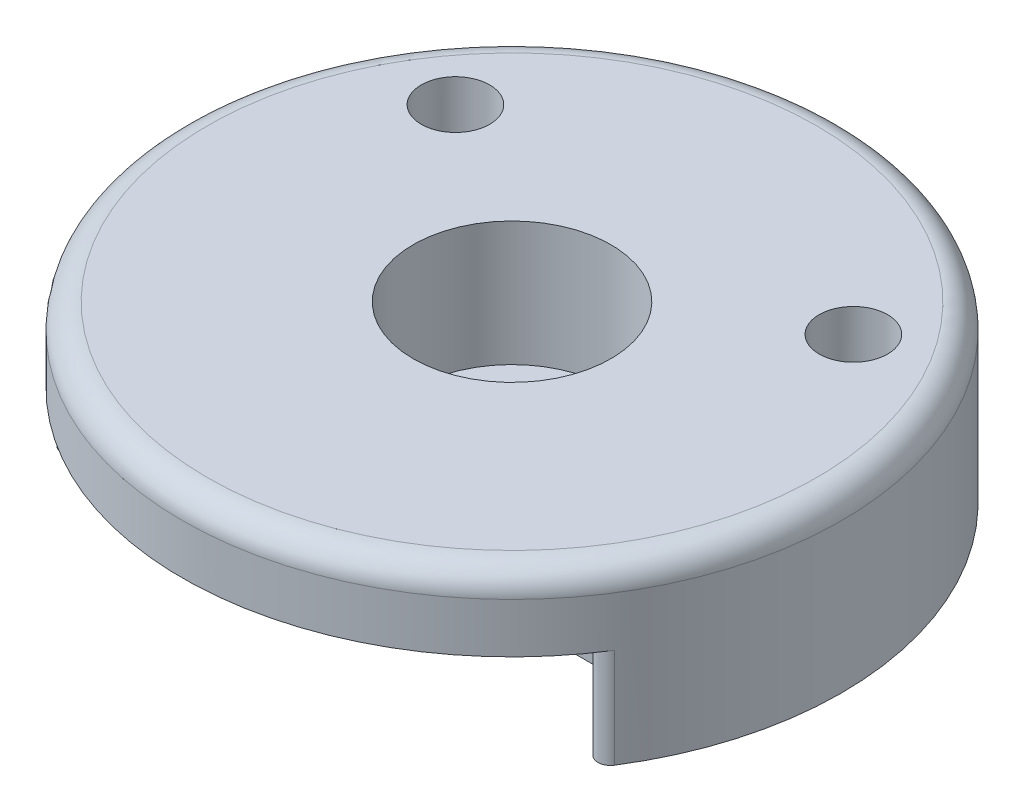
ISO-10303-21;
HEADER;
FILE_DESCRIPTION(('STEP AP214'),'2;1');
FILE_NAME('part.step','',(''),(''),'','','');
FILE_SCHEMA(('AUTOMOTIVE_DESIGN { 1 0 10303 214 1 1 1 1 }'));
ENDSEC;
DATA;
#1=APPLICATION_CONTEXT('core data for automotive mechanical design processes');
#2=APPLICATION_PROTOCOL_DEFINITION('international standard','automotive_design',2000,#1);
#3=PRODUCT_CONTEXT('',#1,'mechanical');
#4=PRODUCT('Part','Part','',(#3));
#5=PRODUCT_RELATED_PRODUCT_CATEGORY('part','',(#4));
#6=PRODUCT_DEFINITION_FORMATION('','',#4);
#7=PRODUCT_DEFINITION_CONTEXT('part definition',#1,'design');
#8=PRODUCT_DEFINITION('design','',#6,#7);
#9=PRODUCT_DEFINITION_SHAPE('','',#8);
#10=(LENGTH_UNIT() NAMED_UNIT(*) SI_UNIT(.MILLI.,.METRE.));
#11=(NAMED_UNIT(*) PLANE_ANGLE_UNIT() SI_UNIT($,.RADIAN.));
#12=(NAMED_UNIT(*) SI_UNIT($,.STERADIAN.) SOLID_ANGLE_UNIT());
#13=UNCERTAINTY_MEASURE_WITH_UNIT(LENGTH_MEASURE(1.E-05),#10,'distance_accuracy_value','');
#14=(GEOMETRIC_REPRESENTATION_CONTEXT(3) GLOBAL_UNCERTAINTY_ASSIGNED_CONTEXT((#13)) GLOBAL_UNIT_ASSIGNED_CONTEXT((#10,
#11,#12)) REPRESENTATION_CONTEXT('',''));
#15=CARTESIAN_POINT('',(0.,0.,0.));
#16=DIRECTION('',(0.,0.,1.));
#17=DIRECTION('',(1.,0.,0.));
#18=AXIS2_PLACEMENT_3D('',#15,#16,#17);
#19=CARTESIAN_POINT('',(0.,7.,0.));
#20=DIRECTION('',(0.,-1.,0.));
#21=DIRECTION('',(0.,0.,-1.));
#22=AXIS2_PLACEMENT_3D('',#19,#20,#21);
#23=CYLINDRICAL_SURFACE('',#22,13.25);
#24=CARTESIAN_POINT('',(0.,6.,0.));
#25=DIRECTION('',(0.,1.,0.));
#26=DIRECTION('',(0.,0.,1.));
#27=AXIS2_PLACEMENT_3D('',#24,#25,#26);
#28=CIRCLE('',#27,13.25);
#29=CARTESIAN_POINT('',(0.,6.,13.25));
#30=VERTEX_POINT('',#29);
#31=EDGE_CURVE('E191',#30,#30,#28,.F.);
#32=ORIENTED_EDGE('',*,*,#31,.T.);
#33=EDGE_LOOP('',(#32));
#34=FACE_BOUND('',#33,.T.);
#35=CARTESIAN_POINT('',(0.,4.,0.));
#36=DIRECTION('',(0.,-1.,0.));
#37=DIRECTION('',(0.,0.,-1.));
#38=AXIS2_PLACEMENT_3D('',#35,#36,#37);
#39=CIRCLE('',#38,13.25);
#40=CARTESIAN_POINT('',(11.1975490196078,4.,7.08360049363877));
#41=VERTEX_POINT('',#40);
#42=CARTESIAN_POINT('',(-11.1975490196078,4.,7.08360049363877));
#43=VERTEX_POINT('',#42);
#44=EDGE_CURVE('E198',#41,#43,#39,.T.);
#45=ORIENTED_EDGE('',*,*,#44,.F.);
#46=DIRECTION('',(0.,-1.,0.));
#47=VECTOR('',#46,1.);
#48=CARTESIAN_POINT('',(11.1975490196078,7.,7.08360049363877));
#49=LINE('',#48,#47);
#50=CARTESIAN_POINT('',(11.1975490196078,0.,7.08360049363877));
#51=VERTEX_POINT('',#50);
#52=EDGE_CURVE('E209',#41,#51,#49,.T.);
#53=ORIENTED_EDGE('',*,*,#52,.T.);
#54=CARTESIAN_POINT('',(0.,0.,0.));
#55=DIRECTION('',(0.,1.,0.));
#56=DIRECTION('',(0.,0.,1.));
#57=AXIS2_PLACEMENT_3D('',#54,#55,#56);
#58=CIRCLE('',#57,13.25);
#59=CARTESIAN_POINT('',(-11.1975490196078,0.,7.08360049363877));
#60=VERTEX_POINT('',#59);
#61=EDGE_CURVE('E180',#51,#60,#58,.T.);
#62=ORIENTED_EDGE('',*,*,#61,.T.);
#63=DIRECTION('',(0.,-1.,0.));
#64=VECTOR('',#63,1.);
#65=CARTESIAN_POINT('',(-11.1975490196078,7.,7.08360049363877));
#66=LINE('',#65,#64);
#67=EDGE_CURVE('E205',#60,#43,#66,.F.);
#68=ORIENTED_EDGE('',*,*,#67,.T.);
#69=EDGE_LOOP('',(#45,#53,#62,#68));
#70=FACE_BOUND('',#69,.T.);
#71=ADVANCED_FACE('F39',(#34,#70),#23,.T.);
#72=CARTESIAN_POINT('',(0.,0.,0.));
#73=DIRECTION('',(0.,1.,0.));
#74=DIRECTION('',(0.,0.,1.));
#75=AXIS2_PLACEMENT_3D('',#72,#73,#74);
#76=PLANE('',#75);
#77=ORIENTED_EDGE('',*,*,#61,.F.);
#78=CARTESIAN_POINT('',(10.775,0.,6.81629481463353));
#79=DIRECTION('',(0.,1.,0.));
#80=DIRECTION('',(0.,0.,1.));
#81=AXIS2_PLACEMENT_3D('',#78,#79,#80);
#82=CIRCLE('',#81,0.5);
#83=CARTESIAN_POINT('',(10.275,0.,6.81629481463353));
#84=VERTEX_POINT('',#83);
#85=EDGE_CURVE('E214',#51,#84,#82,.F.);
#86=ORIENTED_EDGE('',*,*,#85,.T.);
#87=DIRECTION('',(0.,0.,1.));
#88=VECTOR('',#87,1.);
#89=CARTESIAN_POINT('',(10.275,0.,8.025));
#90=LINE('',#89,#88);
#91=CARTESIAN_POINT('',(10.275,0.,-8.025));
#92=VERTEX_POINT('',#91);
#93=EDGE_CURVE('E141',#92,#84,#90,.T.);
#94=ORIENTED_EDGE('',*,*,#93,.F.);
#95=DIRECTION('',(1.,0.,0.));
#96=VECTOR('',#95,1.);
#97=CARTESIAN_POINT('',(-10.275,0.,-8.025));
#98=LINE('',#97,#96);
#99=CARTESIAN_POINT('',(-10.275,0.,-8.025));
#100=VERTEX_POINT('',#99);
#101=EDGE_CURVE('E152',#100,#92,#98,.T.);
#102=ORIENTED_EDGE('',*,*,#101,.F.);
#103=DIRECTION('',(0.,0.,-1.));
#104=VECTOR('',#103,1.);
#105=CARTESIAN_POINT('',(-10.275,0.,8.025));
#106=LINE('',#105,#104);
#107=CARTESIAN_POINT('',(-10.275,0.,6.81629481463354));
#108=VERTEX_POINT('',#107);
#109=EDGE_CURVE('E163',#108,#100,#106,.T.);
#110=ORIENTED_EDGE('',*,*,#109,.F.);
#111=CARTESIAN_POINT('',(-10.775,0.,6.81629481463354));
#112=DIRECTION('',(0.,1.,0.));
#113=DIRECTION('',(0.,0.,1.));
#114=AXIS2_PLACEMENT_3D('',#111,#112,#113);
#115=CIRCLE('',#114,0.5);
#116=EDGE_CURVE('E61',#108,#60,#115,.F.);
#117=ORIENTED_EDGE('',*,*,#116,.T.);
#118=EDGE_LOOP('',(#77,#86,#94,#102,#110,#117));
#119=FACE_BOUND('',#118,.T.);
#120=ADVANCED_FACE('F229',(#119),#76,.F.);
#121=CARTESIAN_POINT('',(0.,1.,0.));
#122=DIRECTION('',(0.,-1.,0.));
#123=DIRECTION('',(0.,0.,-1.));
#124=AXIS2_PLACEMENT_3D('',#121,#122,#123);
#125=PLANE('',#124);
#126=CARTESIAN_POINT('',(-8.,1.,-5.725));
#127=DIRECTION('',(0.,-1.,0.));
#128=DIRECTION('',(0.,0.,-1.));
#129=AXIS2_PLACEMENT_3D('',#126,#127,#128);
#130=CIRCLE('',#129,1.375);
#131=CARTESIAN_POINT('',(-8.,1.,-7.1));
#132=VERTEX_POINT('',#131);
#133=EDGE_CURVE('E132',#132,#132,#130,.T.);
#134=ORIENTED_EDGE('',*,*,#133,.F.);
#135=EDGE_LOOP('',(#134));
#136=FACE_BOUND('',#135,.T.);
#137=CARTESIAN_POINT('',(8.,1.,-5.725));
#138=DIRECTION('',(0.,-1.,0.));
#139=DIRECTION('',(0.,0.,-1.));
#140=AXIS2_PLACEMENT_3D('',#137,#138,#139);
#141=CIRCLE('',#140,1.375);
#142=CARTESIAN_POINT('',(8.,1.,-7.1));
#143=VERTEX_POINT('',#142);
#144=EDGE_CURVE('E121',#143,#143,#141,.T.);
#145=ORIENTED_EDGE('',*,*,#144,.F.);
#146=EDGE_LOOP('',(#145));
#147=FACE_BOUND('',#146,.T.);
#148=DIRECTION('',(0.,0.,1.));
#149=VECTOR('',#148,1.);
#150=CARTESIAN_POINT('',(10.275,1.,8.025));
#151=LINE('',#150,#149);
#152=CARTESIAN_POINT('',(10.275,1.,-8.025));
#153=VERTEX_POINT('',#152);
#154=CARTESIAN_POINT('',(10.275,1.,5.));
#155=VERTEX_POINT('',#154);
#156=EDGE_CURVE('E148',#153,#155,#151,.T.);
#157=ORIENTED_EDGE('',*,*,#156,.T.);
#158=DIRECTION('',(-1.,0.,0.));
#159=VECTOR('',#158,1.);
#160=CARTESIAN_POINT('',(0.,1.,5.));
#161=LINE('',#160,#159);
#162=CARTESIAN_POINT('',(-10.275,1.,5.));
#163=VERTEX_POINT('',#162);
#164=EDGE_CURVE('E195',#155,#163,#161,.T.);
#165=ORIENTED_EDGE('',*,*,#164,.T.);
#166=DIRECTION('',(0.,0.,-1.));
#167=VECTOR('',#166,1.);
#168=CARTESIAN_POINT('',(-10.275,1.,8.025));
#169=LINE('',#168,#167);
#170=CARTESIAN_POINT('',(-10.275,1.,-8.025));
#171=VERTEX_POINT('',#170);
#172=EDGE_CURVE('E116',#163,#171,#169,.T.);
#173=ORIENTED_EDGE('',*,*,#172,.T.);
#174=DIRECTION('',(1.,0.,0.));
#175=VECTOR('',#174,1.);
#176=CARTESIAN_POINT('',(-10.275,1.,-8.025));
#177=LINE('',#176,#175);
#178=EDGE_CURVE('E155',#171,#153,#177,.T.);
#179=ORIENTED_EDGE('',*,*,#178,.T.);
#180=EDGE_LOOP('',(#157,#165,#173,#179));
#181=FACE_BOUND('',#180,.T.);
#182=ADVANCED_FACE('F238',(#136,#147,#181),#125,.T.);
#183=CARTESIAN_POINT('',(0.,7.,0.));
#184=DIRECTION('',(0.,1.,0.));
#185=DIRECTION('',(0.,0.,1.));
#186=AXIS2_PLACEMENT_3D('',#183,#184,#185);
#187=PLANE('',#186);
#188=CARTESIAN_POINT('',(0.,7.,0.));
#189=DIRECTION('',(0.,1.,0.));
#190=DIRECTION('',(0.,0.,1.));
#191=AXIS2_PLACEMENT_3D('',#188,#189,#190);
#192=CIRCLE('',#191,12.25);
#193=CARTESIAN_POINT('',(0.,7.,12.25));
#194=VERTEX_POINT('',#193);
#195=EDGE_CURVE('E187',#194,#194,#192,.T.);
#196=ORIENTED_EDGE('',*,*,#195,.T.);
#197=EDGE_LOOP('',(#196));
#198=FACE_BOUND('',#197,.T.);
#199=CARTESIAN_POINT('',(-8.,7.,-5.725));
#200=DIRECTION('',(0.,1.,0.));
#201=DIRECTION('',(0.,0.,1.));
#202=AXIS2_PLACEMENT_3D('',#199,#200,#201);
#203=CIRCLE('',#202,1.375);
#204=CARTESIAN_POINT('',(-8.,7.,-4.35));
#205=VERTEX_POINT('',#204);
#206=EDGE_CURVE('E136',#205,#205,#203,.F.);
#207=ORIENTED_EDGE('',*,*,#206,.T.);
#208=EDGE_LOOP('',(#207));
#209=FACE_BOUND('',#208,.T.);
#210=CARTESIAN_POINT('',(8.,7.,-5.725));
#211=DIRECTION('',(0.,1.,0.));
#212=DIRECTION('',(0.,0.,1.));
#213=AXIS2_PLACEMENT_3D('',#210,#211,#212);
#214=CIRCLE('',#213,1.375);
#215=CARTESIAN_POINT('',(8.,7.,-4.35));
#216=VERTEX_POINT('',#215);
#217=EDGE_CURVE('E137',#216,#216,#214,.F.);
#218=ORIENTED_EDGE('',*,*,#217,.T.);
#219=EDGE_LOOP('',(#218));
#220=FACE_BOUND('',#219,.T.);
#221=CARTESIAN_POINT('',(0.,7.,0.));
#222=DIRECTION('',(0.,1.,0.));
#223=DIRECTION('',(0.,0.,1.));
#224=AXIS2_PLACEMENT_3D('',#221,#222,#223);
#225=CIRCLE('',#224,3.975);
#226=CARTESIAN_POINT('',(0.,7.,3.975));
#227=VERTEX_POINT('',#226);
#228=EDGE_CURVE('E172',#227,#227,#225,.T.);
#229=ORIENTED_EDGE('',*,*,#228,.F.);
#230=EDGE_LOOP('',(#229));
#231=FACE_BOUND('',#230,.T.);
#232=ADVANCED_FACE('F286',(#198,#209,#220,#231),#187,.T.);
#233=CARTESIAN_POINT('',(0.,2.,0.));
#234=DIRECTION('',(0.,1.,0.));
#235=DIRECTION('',(0.,0.,1.));
#236=AXIS2_PLACEMENT_3D('',#233,#234,#235);
#237=CYLINDRICAL_SURFACE('',#236,3.975);
#238=CARTESIAN_POINT('',(0.,2.,0.));
#239=DIRECTION('',(0.,1.,0.));
#240=DIRECTION('',(0.,0.,1.));
#241=AXIS2_PLACEMENT_3D('',#238,#239,#240);
#242=CIRCLE('',#241,3.975);
#243=CARTESIAN_POINT('',(0.,2.,3.975));
#244=VERTEX_POINT('',#243);
#245=EDGE_CURVE('E176',#244,#244,#242,.T.);
#246=ORIENTED_EDGE('',*,*,#245,.F.);
#247=EDGE_LOOP('',(#246));
#248=FACE_BOUND('',#247,.T.);
#249=ORIENTED_EDGE('',*,*,#228,.T.);
#250=EDGE_LOOP('',(#249));
#251=FACE_BOUND('',#250,.T.);
#252=ADVANCED_FACE('F250',(#248,#251),#237,.F.);
#253=CARTESIAN_POINT('',(0.,2.,0.));
#254=DIRECTION('',(0.,1.,0.));
#255=DIRECTION('',(0.,0.,1.));
#256=AXIS2_PLACEMENT_3D('',#253,#254,#255);
#257=PLANE('',#256);
#258=ORIENTED_EDGE('',*,*,#245,.T.);
#259=EDGE_LOOP('',(#258));
#260=FACE_BOUND('',#259,.T.);
#261=ADVANCED_FACE('F243',(#260),#257,.T.);
#262=CARTESIAN_POINT('',(10.275,1.,8.025));
#263=DIRECTION('',(1.,0.,0.));
#264=DIRECTION('',(0.,0.,-1.));
#265=AXIS2_PLACEMENT_3D('',#262,#263,#264);
#266=PLANE('',#265);
#267=ORIENTED_EDGE('',*,*,#93,.T.);
#268=DIRECTION('',(0.,-1.,0.));
#269=VECTOR('',#268,1.);
#270=CARTESIAN_POINT('',(10.275,1.,6.81629481463353));
#271=LINE('',#270,#269);
#272=CARTESIAN_POINT('',(10.275,4.,6.81629481463353));
#273=VERTEX_POINT('',#272);
#274=EDGE_CURVE('E201',#84,#273,#271,.F.);
#275=ORIENTED_EDGE('',*,*,#274,.T.);
#276=DIRECTION('',(0.,0.,1.));
#277=VECTOR('',#276,1.);
#278=CARTESIAN_POINT('',(10.275,4.,5.));
#279=LINE('',#278,#277);
#280=CARTESIAN_POINT('',(10.275,4.,5.));
#281=VERTEX_POINT('',#280);
#282=EDGE_CURVE('E110',#281,#273,#279,.T.);
#283=ORIENTED_EDGE('',*,*,#282,.F.);
#284=DIRECTION('',(0.,1.,0.));
#285=VECTOR('',#284,1.);
#286=CARTESIAN_POINT('',(10.275,-22.1441865960346,5.));
#287=LINE('',#286,#285);
#288=EDGE_CURVE('E122',#155,#281,#287,.T.);
#289=ORIENTED_EDGE('',*,*,#288,.F.);
#290=ORIENTED_EDGE('',*,*,#156,.F.);
#291=DIRECTION('',(0.,-1.,0.));
#292=VECTOR('',#291,1.);
#293=CARTESIAN_POINT('',(10.275,1.,-8.025));
#294=LINE('',#293,#292);
#295=EDGE_CURVE('E169',#153,#92,#294,.T.);
#296=ORIENTED_EDGE('',*,*,#295,.T.);
#297=EDGE_LOOP('',(#267,#275,#283,#289,#290,#296));
#298=FACE_BOUND('',#297,.T.);
#299=ADVANCED_FACE('F240',(#298),#266,.F.);
#300=CARTESIAN_POINT('',(-10.275,1.,-8.025));
#301=DIRECTION('',(0.,0.,-1.));
#302=DIRECTION('',(-1.,0.,0.));
#303=AXIS2_PLACEMENT_3D('',#300,#301,#302);
#304=PLANE('',#303);
#305=ORIENTED_EDGE('',*,*,#101,.T.);
#306=ORIENTED_EDGE('',*,*,#295,.F.);
#307=ORIENTED_EDGE('',*,*,#178,.F.);
#308=DIRECTION('',(0.,-1.,0.));
#309=VECTOR('',#308,1.);
#310=CARTESIAN_POINT('',(-10.275,1.,-8.025));
#311=LINE('',#310,#309);
#312=EDGE_CURVE('E159',#171,#100,#311,.T.);
#313=ORIENTED_EDGE('',*,*,#312,.T.);
#314=EDGE_LOOP('',(#305,#306,#307,#313));
#315=FACE_BOUND('',#314,.T.);
#316=ADVANCED_FACE('F235',(#315),#304,.F.);
#317=CARTESIAN_POINT('',(-10.275,1.,8.025));
#318=DIRECTION('',(-1.,0.,0.));
#319=DIRECTION('',(0.,0.,1.));
#320=AXIS2_PLACEMENT_3D('',#317,#318,#319);
#321=PLANE('',#320);
#322=DIRECTION('',(0.,0.,-1.));
#323=VECTOR('',#322,1.);
#324=CARTESIAN_POINT('',(-10.275,4.,5.));
#325=LINE('',#324,#323);
#326=CARTESIAN_POINT('',(-10.275,4.,6.81629481463354));
#327=VERTEX_POINT('',#326);
#328=CARTESIAN_POINT('',(-10.275,4.,5.));
#329=VERTEX_POINT('',#328);
#330=EDGE_CURVE('E102',#327,#329,#325,.T.);
#331=ORIENTED_EDGE('',*,*,#330,.F.);
#332=DIRECTION('',(0.,-1.,0.));
#333=VECTOR('',#332,1.);
#334=CARTESIAN_POINT('',(-10.275,1.,6.81629481463354));
#335=LINE('',#334,#333);
#336=EDGE_CURVE('E217',#327,#108,#335,.T.);
#337=ORIENTED_EDGE('',*,*,#336,.T.);
#338=ORIENTED_EDGE('',*,*,#109,.T.);
#339=ORIENTED_EDGE('',*,*,#312,.F.);
#340=ORIENTED_EDGE('',*,*,#172,.F.);
#341=DIRECTION('',(0.,1.,0.));
#342=VECTOR('',#341,1.);
#343=CARTESIAN_POINT('',(-10.275,-22.1441865960346,5.));
#344=LINE('',#343,#342);
#345=EDGE_CURVE('E113',#163,#329,#344,.T.);
#346=ORIENTED_EDGE('',*,*,#345,.T.);
#347=EDGE_LOOP('',(#331,#337,#338,#339,#340,#346));
#348=FACE_BOUND('',#347,.T.);
#349=ADVANCED_FACE('F114',(#348),#321,.F.);
#350=CARTESIAN_POINT('',(8.,10.889087296526,-5.725));
#351=DIRECTION('',(0.,-1.,0.));
#352=DIRECTION('',(0.,0.,-1.));
#353=AXIS2_PLACEMENT_3D('',#350,#351,#352);
#354=CYLINDRICAL_SURFACE('',#353,1.375);
#355=ORIENTED_EDGE('',*,*,#144,.T.);
#356=EDGE_LOOP('',(#355));
#357=FACE_BOUND('',#356,.T.);
#358=ORIENTED_EDGE('',*,*,#217,.F.);
#359=EDGE_LOOP('',(#358));
#360=FACE_BOUND('',#359,.T.);
#361=ADVANCED_FACE('F280',(#357,#360),#354,.F.);
#362=CARTESIAN_POINT('',(-8.,10.889087296526,-5.725));
#363=DIRECTION('',(0.,-1.,0.));
#364=DIRECTION('',(0.,0.,-1.));
#365=AXIS2_PLACEMENT_3D('',#362,#363,#364);
#366=CYLINDRICAL_SURFACE('',#365,1.375);
#367=ORIENTED_EDGE('',*,*,#133,.T.);
#368=EDGE_LOOP('',(#367));
#369=FACE_BOUND('',#368,.T.);
#370=ORIENTED_EDGE('',*,*,#206,.F.);
#371=EDGE_LOOP('',(#370));
#372=FACE_BOUND('',#371,.T.);
#373=ADVANCED_FACE('F265',(#369,#372),#366,.F.);
#374=CARTESIAN_POINT('',(0.,6.,0.));
#375=DIRECTION('',(0.,1.,0.));
#376=DIRECTION('',(0.,0.,1.));
#377=AXIS2_PLACEMENT_3D('',#374,#375,#376);
#378=TOROIDAL_SURFACE('',#377,12.25,1.);
#379=ORIENTED_EDGE('',*,*,#31,.F.);
#380=EDGE_LOOP('',(#379));
#381=FACE_BOUND('',#380,.T.);
#382=ORIENTED_EDGE('',*,*,#195,.F.);
#383=EDGE_LOOP('',(#382));
#384=FACE_BOUND('',#383,.T.);
#385=ADVANCED_FACE('F263',(#381,#384),#378,.T.);
#386=CARTESIAN_POINT('',(0.,4.,0.));
#387=DIRECTION('',(0.,-1.,0.));
#388=DIRECTION('',(0.,0.,-1.));
#389=AXIS2_PLACEMENT_3D('',#386,#387,#388);
#390=PLANE('',#389);
#391=ORIENTED_EDGE('',*,*,#282,.T.);
#392=CARTESIAN_POINT('',(10.775,4.,6.81629481463353));
#393=DIRECTION('',(0.,-1.,0.));
#394=DIRECTION('',(0.,0.,-1.));
#395=AXIS2_PLACEMENT_3D('',#392,#393,#394);
#396=CIRCLE('',#395,0.5);
#397=EDGE_CURVE('E48',#273,#41,#396,.F.);
#398=ORIENTED_EDGE('',*,*,#397,.T.);
#399=ORIENTED_EDGE('',*,*,#44,.T.);
#400=CARTESIAN_POINT('',(-10.775,4.,6.81629481463354));
#401=DIRECTION('',(0.,-1.,0.));
#402=DIRECTION('',(0.,0.,-1.));
#403=AXIS2_PLACEMENT_3D('',#400,#401,#402);
#404=CIRCLE('',#403,0.5);
#405=EDGE_CURVE('E11',#43,#327,#404,.F.);
#406=ORIENTED_EDGE('',*,*,#405,.T.);
#407=ORIENTED_EDGE('',*,*,#330,.T.);
#408=DIRECTION('',(1.,0.,0.));
#409=VECTOR('',#408,1.);
#410=CARTESIAN_POINT('',(10.275,4.,5.));
#411=LINE('',#410,#409);
#412=EDGE_CURVE('E107',#329,#281,#411,.T.);
#413=ORIENTED_EDGE('',*,*,#412,.T.);
#414=EDGE_LOOP('',(#391,#398,#399,#406,#407,#413));
#415=FACE_BOUND('',#414,.T.);
#416=ADVANCED_FACE('F105',(#415),#390,.T.);
#417=CARTESIAN_POINT('',(10.275,-22.1441865960346,5.));
#418=DIRECTION('',(0.,0.,1.));
#419=DIRECTION('',(1.,0.,0.));
#420=AXIS2_PLACEMENT_3D('',#417,#418,#419);
#421=PLANE('',#420);
#422=ORIENTED_EDGE('',*,*,#288,.T.);
#423=ORIENTED_EDGE('',*,*,#412,.F.);
#424=ORIENTED_EDGE('',*,*,#345,.F.);
#425=ORIENTED_EDGE('',*,*,#164,.F.);
#426=EDGE_LOOP('',(#422,#423,#424,#425));
#427=FACE_BOUND('',#426,.T.);
#428=ADVANCED_FACE('F124',(#427),#421,.T.);
#429=CARTESIAN_POINT('',(10.775,7.,6.81629481463353));
#430=DIRECTION('',(0.,-1.,0.));
#431=DIRECTION('',(0.,0.,-1.));
#432=AXIS2_PLACEMENT_3D('',#429,#430,#431);
#433=CYLINDRICAL_SURFACE('',#432,0.5);
#434=ORIENTED_EDGE('',*,*,#85,.F.);
#435=ORIENTED_EDGE('',*,*,#52,.F.);
#436=ORIENTED_EDGE('',*,*,#397,.F.);
#437=ORIENTED_EDGE('',*,*,#274,.F.);
#438=EDGE_LOOP('',(#434,#435,#436,#437));
#439=FACE_BOUND('',#438,.T.);
#440=ADVANCED_FACE('F225',(#439),#433,.T.);
#441=CARTESIAN_POINT('',(-10.775,7.,6.81629481463354));
#442=DIRECTION('',(0.,-1.,0.));
#443=DIRECTION('',(0.,0.,-1.));
#444=AXIS2_PLACEMENT_3D('',#441,#442,#443);
#445=CYLINDRICAL_SURFACE('',#444,0.5);
#446=ORIENTED_EDGE('',*,*,#405,.F.);
#447=ORIENTED_EDGE('',*,*,#67,.F.);
#448=ORIENTED_EDGE('',*,*,#116,.F.);
#449=ORIENTED_EDGE('',*,*,#336,.F.);
#450=EDGE_LOOP('',(#446,#447,#448,#449));
#451=FACE_BOUND('',#450,.T.);
#452=ADVANCED_FACE('F41',(#451),#445,.T.);
#453=CLOSED_SHELL('',(#71,#120,#182,#232,#252,#261,#299,#316,#349,#361,#373,#385,#416,#428,#440,#452));
#454=MANIFOLD_SOLID_BREP('B2',#453);
#455=ADVANCED_BREP_SHAPE_REPRESENTATION('',(#18,#454),#14);
#456=SHAPE_DEFINITION_REPRESENTATION(#9,#455);
ENDSEC;
END-ISO-10303-21;
